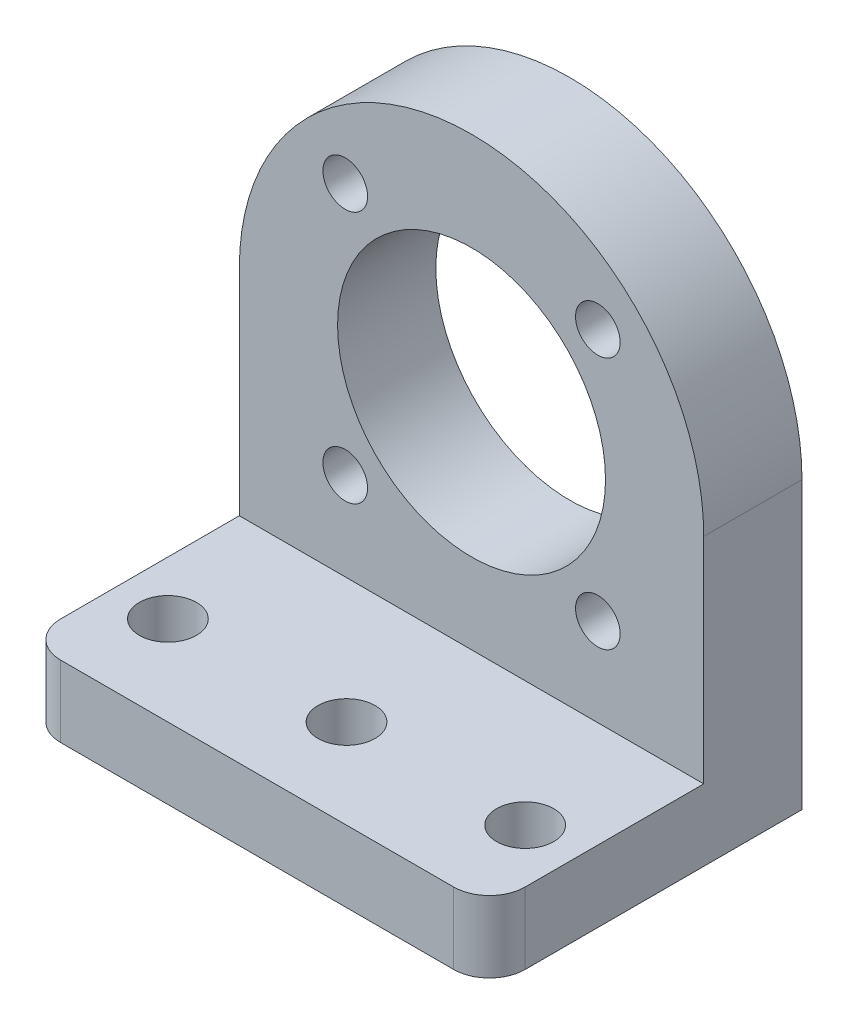
ISO-10303-21;
HEADER;
FILE_DESCRIPTION(('STEP AP214'),'2;1');
FILE_NAME('part.step','',(''),(''),'','','');
FILE_SCHEMA(('AUTOMOTIVE_DESIGN { 1 0 10303 214 1 1 1 1 }'));
ENDSEC;
DATA;
#1=APPLICATION_CONTEXT('core data for automotive mechanical design processes');
#2=APPLICATION_PROTOCOL_DEFINITION('international standard','automotive_design',2000,#1);
#3=PRODUCT_CONTEXT('',#1,'mechanical');
#4=PRODUCT('Part','Part','',(#3));
#5=PRODUCT_RELATED_PRODUCT_CATEGORY('part','',(#4));
#6=PRODUCT_DEFINITION_FORMATION('','',#4);
#7=PRODUCT_DEFINITION_CONTEXT('part definition',#1,'design');
#8=PRODUCT_DEFINITION('design','',#6,#7);
#9=PRODUCT_DEFINITION_SHAPE('','',#8);
#10=(LENGTH_UNIT() NAMED_UNIT(*) SI_UNIT(.MILLI.,.METRE.));
#11=(NAMED_UNIT(*) PLANE_ANGLE_UNIT() SI_UNIT($,.RADIAN.));
#12=(NAMED_UNIT(*) SI_UNIT($,.STERADIAN.) SOLID_ANGLE_UNIT());
#13=UNCERTAINTY_MEASURE_WITH_UNIT(LENGTH_MEASURE(1.E-05),#10,'distance_accuracy_value','');
#14=(GEOMETRIC_REPRESENTATION_CONTEXT(3) GLOBAL_UNCERTAINTY_ASSIGNED_CONTEXT((#13)) GLOBAL_UNIT_ASSIGNED_CONTEXT((#10,
#11,#12)) REPRESENTATION_CONTEXT('',''));
#15=CARTESIAN_POINT('',(0.,0.,0.));
#16=DIRECTION('',(0.,0.,1.));
#17=DIRECTION('',(1.,0.,0.));
#18=AXIS2_PLACEMENT_3D('',#15,#16,#17);
#19=CARTESIAN_POINT('',(0.,0.,5.5));
#20=DIRECTION('',(0.,0.,1.));
#21=DIRECTION('',(1.,0.,0.));
#22=AXIS2_PLACEMENT_3D('',#19,#20,#21);
#23=PLANE('',#22);
#24=DIRECTION('',(-1.,0.,0.));
#25=VECTOR('',#24,1.);
#26=CARTESIAN_POINT('',(-13.,-12.,5.5));
#27=LINE('',#26,#25);
#28=CARTESIAN_POINT('',(13.,-12.,5.5));
#29=VERTEX_POINT('',#28);
#30=CARTESIAN_POINT('',(-13.,-12.,5.5));
#31=VERTEX_POINT('',#30);
#32=EDGE_CURVE('E123',#29,#31,#27,.T.);
#33=ORIENTED_EDGE('',*,*,#32,.F.);
#34=DIRECTION('',(0.,1.,0.));
#35=VECTOR('',#34,1.);
#36=CARTESIAN_POINT('',(13.,-16.,5.5));
#37=LINE('',#36,#35);
#38=CARTESIAN_POINT('',(13.,0.,5.5));
#39=VERTEX_POINT('',#38);
#40=EDGE_CURVE('E129',#29,#39,#37,.T.);
#41=ORIENTED_EDGE('',*,*,#40,.T.);
#42=CARTESIAN_POINT('',(0.,0.,5.5));
#43=DIRECTION('',(0.,0.,1.));
#44=DIRECTION('',(1.,0.,0.));
#45=AXIS2_PLACEMENT_3D('',#42,#43,#44);
#46=CIRCLE('',#45,13.);
#47=CARTESIAN_POINT('',(-13.,0.,5.5));
#48=VERTEX_POINT('',#47);
#49=EDGE_CURVE('E126',#39,#48,#46,.T.);
#50=ORIENTED_EDGE('',*,*,#49,.T.);
#51=DIRECTION('',(0.,-1.,0.));
#52=VECTOR('',#51,1.);
#53=CARTESIAN_POINT('',(-13.,0.,5.5));
#54=LINE('',#53,#52);
#55=EDGE_CURVE('E110',#48,#31,#54,.T.);
#56=ORIENTED_EDGE('',*,*,#55,.T.);
#57=EDGE_LOOP('',(#33,#41,#50,#56));
#58=FACE_BOUND('',#57,.T.);
#59=CARTESIAN_POINT('',(7.07106781186552,-7.07106781186543,5.5));
#60=DIRECTION('',(0.,0.,1.));
#61=DIRECTION('',(1.,0.,0.));
#62=AXIS2_PLACEMENT_3D('',#59,#60,#61);
#63=CIRCLE('',#62,1.25);
#64=CARTESIAN_POINT('',(8.32106781186552,-7.07106781186543,5.5));
#65=VERTEX_POINT('',#64);
#66=EDGE_CURVE('E157',#65,#65,#63,.T.);
#67=ORIENTED_EDGE('',*,*,#66,.F.);
#68=EDGE_LOOP('',(#67));
#69=FACE_BOUND('',#68,.T.);
#70=CARTESIAN_POINT('',(-7.07106781186551,7.07106781186543,5.5));
#71=DIRECTION('',(0.,0.,1.));
#72=DIRECTION('',(1.,0.,0.));
#73=AXIS2_PLACEMENT_3D('',#70,#71,#72);
#74=CIRCLE('',#73,1.25);
#75=CARTESIAN_POINT('',(-5.82106781186551,7.07106781186543,5.5));
#76=VERTEX_POINT('',#75);
#77=EDGE_CURVE('E173',#76,#76,#74,.T.);
#78=ORIENTED_EDGE('',*,*,#77,.F.);
#79=EDGE_LOOP('',(#78));
#80=FACE_BOUND('',#79,.T.);
#81=CARTESIAN_POINT('',(0.,0.,5.5));
#82=DIRECTION('',(0.,0.,1.));
#83=DIRECTION('',(1.,0.,0.));
#84=AXIS2_PLACEMENT_3D('',#81,#82,#83);
#85=CIRCLE('',#84,7.5);
#86=CARTESIAN_POINT('',(7.5,0.,5.5));
#87=VERTEX_POINT('',#86);
#88=EDGE_CURVE('E181',#87,#87,#85,.T.);
#89=ORIENTED_EDGE('',*,*,#88,.F.);
#90=EDGE_LOOP('',(#89));
#91=FACE_BOUND('',#90,.T.);
#92=CARTESIAN_POINT('',(7.07106781186544,7.07106781186551,5.5));
#93=DIRECTION('',(0.,0.,1.));
#94=DIRECTION('',(1.,0.,0.));
#95=AXIS2_PLACEMENT_3D('',#92,#93,#94);
#96=CIRCLE('',#95,1.25);
#97=CARTESIAN_POINT('',(8.32106781186544,7.07106781186551,5.5));
#98=VERTEX_POINT('',#97);
#99=EDGE_CURVE('E165',#98,#98,#96,.T.);
#100=ORIENTED_EDGE('',*,*,#99,.F.);
#101=EDGE_LOOP('',(#100));
#102=FACE_BOUND('',#101,.T.);
#103=CARTESIAN_POINT('',(-7.07106781186543,-7.07106781186552,5.5));
#104=DIRECTION('',(0.,0.,1.));
#105=DIRECTION('',(1.,0.,0.));
#106=AXIS2_PLACEMENT_3D('',#103,#104,#105);
#107=CIRCLE('',#106,1.25);
#108=CARTESIAN_POINT('',(-5.82106781186543,-7.07106781186552,5.5));
#109=VERTEX_POINT('',#108);
#110=EDGE_CURVE('E149',#109,#109,#107,.T.);
#111=ORIENTED_EDGE('',*,*,#110,.F.);
#112=EDGE_LOOP('',(#111));
#113=FACE_BOUND('',#112,.T.);
#114=ADVANCED_FACE('F41',(#58,#69,#80,#91,#102,#113),#23,.T.);
#115=CARTESIAN_POINT('',(0.,0.,0.));
#116=DIRECTION('',(0.,0.,1.));
#117=DIRECTION('',(1.,0.,0.));
#118=AXIS2_PLACEMENT_3D('',#115,#116,#117);
#119=PLANE('',#118);
#120=CARTESIAN_POINT('',(0.,0.,0.));
#121=DIRECTION('',(0.,0.,1.));
#122=DIRECTION('',(1.,0.,0.));
#123=AXIS2_PLACEMENT_3D('',#120,#121,#122);
#124=CIRCLE('',#123,13.);
#125=CARTESIAN_POINT('',(13.,0.,0.));
#126=VERTEX_POINT('',#125);
#127=CARTESIAN_POINT('',(-13.,0.,0.));
#128=VERTEX_POINT('',#127);
#129=EDGE_CURVE('E185',#126,#128,#124,.T.);
#130=ORIENTED_EDGE('',*,*,#129,.F.);
#131=DIRECTION('',(0.,1.,0.));
#132=VECTOR('',#131,1.);
#133=CARTESIAN_POINT('',(13.,-16.,0.));
#134=LINE('',#133,#132);
#135=CARTESIAN_POINT('',(13.,-16.,0.));
#136=VERTEX_POINT('',#135);
#137=EDGE_CURVE('E190',#136,#126,#134,.T.);
#138=ORIENTED_EDGE('',*,*,#137,.F.);
#139=DIRECTION('',(1.,0.,0.));
#140=VECTOR('',#139,1.);
#141=CARTESIAN_POINT('',(-13.,-16.,0.));
#142=LINE('',#141,#140);
#143=CARTESIAN_POINT('',(-13.,-16.,0.));
#144=VERTEX_POINT('',#143);
#145=EDGE_CURVE('E202',#144,#136,#142,.T.);
#146=ORIENTED_EDGE('',*,*,#145,.F.);
#147=DIRECTION('',(0.,-1.,0.));
#148=VECTOR('',#147,1.);
#149=CARTESIAN_POINT('',(-13.,0.,0.));
#150=LINE('',#149,#148);
#151=EDGE_CURVE('E198',#128,#144,#150,.T.);
#152=ORIENTED_EDGE('',*,*,#151,.F.);
#153=EDGE_LOOP('',(#130,#138,#146,#152));
#154=FACE_BOUND('',#153,.T.);
#155=CARTESIAN_POINT('',(0.,0.,0.));
#156=DIRECTION('',(0.,0.,1.));
#157=DIRECTION('',(1.,0.,0.));
#158=AXIS2_PLACEMENT_3D('',#155,#156,#157);
#159=CIRCLE('',#158,7.5);
#160=CARTESIAN_POINT('',(7.5,0.,0.));
#161=VERTEX_POINT('',#160);
#162=EDGE_CURVE('E177',#161,#161,#159,.T.);
#163=ORIENTED_EDGE('',*,*,#162,.T.);
#164=EDGE_LOOP('',(#163));
#165=FACE_BOUND('',#164,.T.);
#166=CARTESIAN_POINT('',(-7.07106781186551,7.07106781186543,0.));
#167=DIRECTION('',(0.,0.,1.));
#168=DIRECTION('',(1.,0.,0.));
#169=AXIS2_PLACEMENT_3D('',#166,#167,#168);
#170=CIRCLE('',#169,1.25);
#171=CARTESIAN_POINT('',(-5.82106781186551,7.07106781186543,0.));
#172=VERTEX_POINT('',#171);
#173=EDGE_CURVE('E169',#172,#172,#170,.T.);
#174=ORIENTED_EDGE('',*,*,#173,.T.);
#175=EDGE_LOOP('',(#174));
#176=FACE_BOUND('',#175,.T.);
#177=CARTESIAN_POINT('',(7.07106781186544,7.07106781186551,0.));
#178=DIRECTION('',(0.,0.,1.));
#179=DIRECTION('',(1.,0.,0.));
#180=AXIS2_PLACEMENT_3D('',#177,#178,#179);
#181=CIRCLE('',#180,1.25);
#182=CARTESIAN_POINT('',(8.32106781186544,7.07106781186551,0.));
#183=VERTEX_POINT('',#182);
#184=EDGE_CURVE('E161',#183,#183,#181,.T.);
#185=ORIENTED_EDGE('',*,*,#184,.T.);
#186=EDGE_LOOP('',(#185));
#187=FACE_BOUND('',#186,.T.);
#188=CARTESIAN_POINT('',(7.07106781186552,-7.07106781186543,0.));
#189=DIRECTION('',(0.,0.,1.));
#190=DIRECTION('',(1.,0.,0.));
#191=AXIS2_PLACEMENT_3D('',#188,#189,#190);
#192=CIRCLE('',#191,1.25);
#193=CARTESIAN_POINT('',(8.32106781186552,-7.07106781186543,0.));
#194=VERTEX_POINT('',#193);
#195=EDGE_CURVE('E153',#194,#194,#192,.T.);
#196=ORIENTED_EDGE('',*,*,#195,.T.);
#197=EDGE_LOOP('',(#196));
#198=FACE_BOUND('',#197,.T.);
#199=CARTESIAN_POINT('',(-7.07106781186543,-7.07106781186552,0.));
#200=DIRECTION('',(0.,0.,1.));
#201=DIRECTION('',(1.,0.,0.));
#202=AXIS2_PLACEMENT_3D('',#199,#200,#201);
#203=CIRCLE('',#202,1.25);
#204=CARTESIAN_POINT('',(-5.82106781186543,-7.07106781186552,0.));
#205=VERTEX_POINT('',#204);
#206=EDGE_CURVE('E148',#205,#205,#203,.T.);
#207=ORIENTED_EDGE('',*,*,#206,.T.);
#208=EDGE_LOOP('',(#207));
#209=FACE_BOUND('',#208,.T.);
#210=ADVANCED_FACE('F255',(#154,#165,#176,#187,#198,#209),#119,.F.);
#211=CARTESIAN_POINT('',(0.,0.,5.5));
#212=DIRECTION('',(0.,0.,-1.));
#213=DIRECTION('',(-1.,0.,0.));
#214=AXIS2_PLACEMENT_3D('',#211,#212,#213);
#215=CYLINDRICAL_SURFACE('',#214,13.);
#216=ORIENTED_EDGE('',*,*,#129,.T.);
#217=DIRECTION('',(0.,0.,-1.));
#218=VECTOR('',#217,1.);
#219=CARTESIAN_POINT('',(-13.,0.,5.5));
#220=LINE('',#219,#218);
#221=EDGE_CURVE('E217',#48,#128,#220,.T.);
#222=ORIENTED_EDGE('',*,*,#221,.F.);
#223=ORIENTED_EDGE('',*,*,#49,.F.);
#224=DIRECTION('',(0.,0.,-1.));
#225=VECTOR('',#224,1.);
#226=CARTESIAN_POINT('',(13.,0.,5.5));
#227=LINE('',#226,#225);
#228=EDGE_CURVE('E194',#39,#126,#227,.T.);
#229=ORIENTED_EDGE('',*,*,#228,.T.);
#230=EDGE_LOOP('',(#216,#222,#223,#229));
#231=FACE_BOUND('',#230,.T.);
#232=ADVANCED_FACE('F252',(#231),#215,.T.);
#233=CARTESIAN_POINT('',(-13.,0.,5.5));
#234=DIRECTION('',(1.,0.,0.));
#235=DIRECTION('',(0.,1.,0.));
#236=AXIS2_PLACEMENT_3D('',#233,#234,#235);
#237=PLANE('',#236);
#238=DIRECTION('',(0.,0.,-1.));
#239=VECTOR('',#238,1.);
#240=CARTESIAN_POINT('',(-13.,-16.,5.5));
#241=LINE('',#240,#239);
#242=CARTESIAN_POINT('',(-13.,-16.,15.5));
#243=VERTEX_POINT('',#242);
#244=EDGE_CURVE('E214',#243,#144,#241,.T.);
#245=ORIENTED_EDGE('',*,*,#244,.F.);
#246=DIRECTION('',(0.,-1.,0.));
#247=VECTOR('',#246,1.);
#248=CARTESIAN_POINT('',(-13.,-12.,15.5));
#249=LINE('',#248,#247);
#250=CARTESIAN_POINT('',(-13.,-12.,15.5));
#251=VERTEX_POINT('',#250);
#252=EDGE_CURVE('E11',#243,#251,#249,.F.);
#253=ORIENTED_EDGE('',*,*,#252,.T.);
#254=DIRECTION('',(0.,0.,-1.));
#255=VECTOR('',#254,1.);
#256=CARTESIAN_POINT('',(-13.,-12.,17.5));
#257=LINE('',#256,#255);
#258=EDGE_CURVE('E106',#251,#31,#257,.T.);
#259=ORIENTED_EDGE('',*,*,#258,.T.);
#260=ORIENTED_EDGE('',*,*,#55,.F.);
#261=ORIENTED_EDGE('',*,*,#221,.T.);
#262=ORIENTED_EDGE('',*,*,#151,.T.);
#263=EDGE_LOOP('',(#245,#253,#259,#260,#261,#262));
#264=FACE_BOUND('',#263,.T.);
#265=ADVANCED_FACE('F108',(#264),#237,.F.);
#266=CARTESIAN_POINT('',(-13.,-16.,5.5));
#267=DIRECTION('',(0.,1.,0.));
#268=DIRECTION('',(0.,0.,1.));
#269=AXIS2_PLACEMENT_3D('',#266,#267,#268);
#270=PLANE('',#269);
#271=CARTESIAN_POINT('',(-10.,-16.,12.5));
#272=DIRECTION('',(0.,1.,0.));
#273=DIRECTION('',(0.,0.,1.));
#274=AXIS2_PLACEMENT_3D('',#271,#272,#273);
#275=CIRCLE('',#274,1.6);
#276=CARTESIAN_POINT('',(-10.,-16.,14.1));
#277=VERTEX_POINT('',#276);
#278=EDGE_CURVE('E135',#277,#277,#275,.T.);
#279=ORIENTED_EDGE('',*,*,#278,.T.);
#280=EDGE_LOOP('',(#279));
#281=FACE_BOUND('',#280,.T.);
#282=CARTESIAN_POINT('',(0.,-16.,12.5));
#283=DIRECTION('',(0.,1.,0.));
#284=DIRECTION('',(0.,0.,1.));
#285=AXIS2_PLACEMENT_3D('',#282,#283,#284);
#286=CIRCLE('',#285,1.6);
#287=CARTESIAN_POINT('',(0.,-16.,14.1));
#288=VERTEX_POINT('',#287);
#289=EDGE_CURVE('E142',#288,#288,#286,.T.);
#290=ORIENTED_EDGE('',*,*,#289,.T.);
#291=EDGE_LOOP('',(#290));
#292=FACE_BOUND('',#291,.T.);
#293=CARTESIAN_POINT('',(10.,-16.,12.5));
#294=DIRECTION('',(0.,1.,0.));
#295=DIRECTION('',(0.,0.,1.));
#296=AXIS2_PLACEMENT_3D('',#293,#294,#295);
#297=CIRCLE('',#296,1.6);
#298=CARTESIAN_POINT('',(10.,-16.,14.1));
#299=VERTEX_POINT('',#298);
#300=EDGE_CURVE('E464',#299,#299,#297,.T.);
#301=ORIENTED_EDGE('',*,*,#300,.T.);
#302=EDGE_LOOP('',(#301));
#303=FACE_BOUND('',#302,.T.);
#304=DIRECTION('',(0.,0.,-1.));
#305=VECTOR('',#304,1.);
#306=CARTESIAN_POINT('',(13.,-16.,5.5));
#307=LINE('',#306,#305);
#308=CARTESIAN_POINT('',(13.,-16.,15.5));
#309=VERTEX_POINT('',#308);
#310=EDGE_CURVE('E211',#309,#136,#307,.T.);
#311=ORIENTED_EDGE('',*,*,#310,.F.);
#312=CARTESIAN_POINT('',(11.,-16.,15.5));
#313=DIRECTION('',(0.,1.,0.));
#314=DIRECTION('',(0.,0.,1.));
#315=AXIS2_PLACEMENT_3D('',#312,#313,#314);
#316=CIRCLE('',#315,2.);
#317=CARTESIAN_POINT('',(11.,-16.,17.5));
#318=VERTEX_POINT('',#317);
#319=EDGE_CURVE('E50',#309,#318,#316,.F.);
#320=ORIENTED_EDGE('',*,*,#319,.T.);
#321=DIRECTION('',(1.,0.,0.));
#322=VECTOR('',#321,1.);
#323=CARTESIAN_POINT('',(-13.,-16.,17.5));
#324=LINE('',#323,#322);
#325=CARTESIAN_POINT('',(-11.,-16.,17.5));
#326=VERTEX_POINT('',#325);
#327=EDGE_CURVE('E134',#326,#318,#324,.T.);
#328=ORIENTED_EDGE('',*,*,#327,.F.);
#329=CARTESIAN_POINT('',(-11.,-16.,15.5));
#330=DIRECTION('',(0.,1.,0.));
#331=DIRECTION('',(0.,0.,1.));
#332=AXIS2_PLACEMENT_3D('',#329,#330,#331);
#333=CIRCLE('',#332,2.);
#334=EDGE_CURVE('E57',#326,#243,#333,.F.);
#335=ORIENTED_EDGE('',*,*,#334,.T.);
#336=ORIENTED_EDGE('',*,*,#244,.T.);
#337=ORIENTED_EDGE('',*,*,#145,.T.);
#338=EDGE_LOOP('',(#311,#320,#328,#335,#336,#337));
#339=FACE_BOUND('',#338,.T.);
#340=ADVANCED_FACE('F239',(#281,#292,#303,#339),#270,.F.);
#341=CARTESIAN_POINT('',(13.,-16.,5.5));
#342=DIRECTION('',(-1.,0.,0.));
#343=DIRECTION('',(0.,-1.,0.));
#344=AXIS2_PLACEMENT_3D('',#341,#342,#343);
#345=PLANE('',#344);
#346=DIRECTION('',(0.,0.,-1.));
#347=VECTOR('',#346,1.);
#348=CARTESIAN_POINT('',(13.,-12.,17.5));
#349=LINE('',#348,#347);
#350=CARTESIAN_POINT('',(13.,-12.,15.5));
#351=VERTEX_POINT('',#350);
#352=EDGE_CURVE('E117',#351,#29,#349,.T.);
#353=ORIENTED_EDGE('',*,*,#352,.F.);
#354=DIRECTION('',(0.,1.,0.));
#355=VECTOR('',#354,1.);
#356=CARTESIAN_POINT('',(13.,-16.,15.5));
#357=LINE('',#356,#355);
#358=EDGE_CURVE('E65',#351,#309,#357,.F.);
#359=ORIENTED_EDGE('',*,*,#358,.T.);
#360=ORIENTED_EDGE('',*,*,#310,.T.);
#361=ORIENTED_EDGE('',*,*,#137,.T.);
#362=ORIENTED_EDGE('',*,*,#228,.F.);
#363=ORIENTED_EDGE('',*,*,#40,.F.);
#364=EDGE_LOOP('',(#353,#359,#360,#361,#362,#363));
#365=FACE_BOUND('',#364,.T.);
#366=ADVANCED_FACE('F247',(#365),#345,.F.);
#367=CARTESIAN_POINT('',(0.,0.,5.5));
#368=DIRECTION('',(0.,0.,-1.));
#369=DIRECTION('',(-1.,0.,0.));
#370=AXIS2_PLACEMENT_3D('',#367,#368,#369);
#371=CYLINDRICAL_SURFACE('',#370,7.5);
#372=ORIENTED_EDGE('',*,*,#88,.T.);
#373=EDGE_LOOP('',(#372));
#374=FACE_BOUND('',#373,.T.);
#375=ORIENTED_EDGE('',*,*,#162,.F.);
#376=EDGE_LOOP('',(#375));
#377=FACE_BOUND('',#376,.T.);
#378=ADVANCED_FACE('F288',(#374,#377),#371,.F.);
#379=CARTESIAN_POINT('',(-7.07106781186551,7.07106781186543,5.5));
#380=DIRECTION('',(0.,0.,-1.));
#381=DIRECTION('',(-1.,0.,0.));
#382=AXIS2_PLACEMENT_3D('',#379,#380,#381);
#383=CYLINDRICAL_SURFACE('',#382,1.25);
#384=ORIENTED_EDGE('',*,*,#77,.T.);
#385=EDGE_LOOP('',(#384));
#386=FACE_BOUND('',#385,.T.);
#387=ORIENTED_EDGE('',*,*,#173,.F.);
#388=EDGE_LOOP('',(#387));
#389=FACE_BOUND('',#388,.T.);
#390=ADVANCED_FACE('F377',(#386,#389),#383,.F.);
#391=CARTESIAN_POINT('',(7.07106781186544,7.07106781186551,5.5));
#392=DIRECTION('',(0.,0.,-1.));
#393=DIRECTION('',(-1.,0.,0.));
#394=AXIS2_PLACEMENT_3D('',#391,#392,#393);
#395=CYLINDRICAL_SURFACE('',#394,1.25);
#396=ORIENTED_EDGE('',*,*,#99,.T.);
#397=EDGE_LOOP('',(#396));
#398=FACE_BOUND('',#397,.T.);
#399=ORIENTED_EDGE('',*,*,#184,.F.);
#400=EDGE_LOOP('',(#399));
#401=FACE_BOUND('',#400,.T.);
#402=ADVANCED_FACE('F280',(#398,#401),#395,.F.);
#403=CARTESIAN_POINT('',(7.07106781186552,-7.07106781186543,5.5));
#404=DIRECTION('',(0.,0.,-1.));
#405=DIRECTION('',(-1.,0.,0.));
#406=AXIS2_PLACEMENT_3D('',#403,#404,#405);
#407=CYLINDRICAL_SURFACE('',#406,1.25);
#408=ORIENTED_EDGE('',*,*,#66,.T.);
#409=EDGE_LOOP('',(#408));
#410=FACE_BOUND('',#409,.T.);
#411=ORIENTED_EDGE('',*,*,#195,.F.);
#412=EDGE_LOOP('',(#411));
#413=FACE_BOUND('',#412,.T.);
#414=ADVANCED_FACE('F271',(#410,#413),#407,.F.);
#415=CARTESIAN_POINT('',(-7.07106781186543,-7.07106781186552,5.5));
#416=DIRECTION('',(0.,0.,-1.));
#417=DIRECTION('',(-1.,0.,0.));
#418=AXIS2_PLACEMENT_3D('',#415,#416,#417);
#419=CYLINDRICAL_SURFACE('',#418,1.25);
#420=ORIENTED_EDGE('',*,*,#110,.T.);
#421=EDGE_LOOP('',(#420));
#422=FACE_BOUND('',#421,.T.);
#423=ORIENTED_EDGE('',*,*,#206,.F.);
#424=EDGE_LOOP('',(#423));
#425=FACE_BOUND('',#424,.T.);
#426=ADVANCED_FACE('F269',(#422,#425),#419,.F.);
#427=CARTESIAN_POINT('',(-13.,-12.,17.5));
#428=DIRECTION('',(0.,-1.,0.));
#429=DIRECTION('',(0.,0.,-1.));
#430=AXIS2_PLACEMENT_3D('',#427,#428,#429);
#431=PLANE('',#430);
#432=CARTESIAN_POINT('',(-10.,-12.,12.5));
#433=DIRECTION('',(0.,1.,0.));
#434=DIRECTION('',(0.,0.,1.));
#435=AXIS2_PLACEMENT_3D('',#432,#433,#434);
#436=CIRCLE('',#435,1.6);
#437=CARTESIAN_POINT('',(-10.,-12.,14.1));
#438=VERTEX_POINT('',#437);
#439=EDGE_CURVE('E467',#438,#438,#436,.T.);
#440=ORIENTED_EDGE('',*,*,#439,.F.);
#441=EDGE_LOOP('',(#440));
#442=FACE_BOUND('',#441,.T.);
#443=CARTESIAN_POINT('',(0.,-12.,12.5));
#444=DIRECTION('',(0.,1.,0.));
#445=DIRECTION('',(0.,0.,1.));
#446=AXIS2_PLACEMENT_3D('',#443,#444,#445);
#447=CIRCLE('',#446,1.6);
#448=CARTESIAN_POINT('',(0.,-12.,14.1));
#449=VERTEX_POINT('',#448);
#450=EDGE_CURVE('E473',#449,#449,#447,.T.);
#451=ORIENTED_EDGE('',*,*,#450,.F.);
#452=EDGE_LOOP('',(#451));
#453=FACE_BOUND('',#452,.T.);
#454=CARTESIAN_POINT('',(10.,-12.,12.5));
#455=DIRECTION('',(0.,1.,0.));
#456=DIRECTION('',(0.,0.,1.));
#457=AXIS2_PLACEMENT_3D('',#454,#455,#456);
#458=CIRCLE('',#457,1.6);
#459=CARTESIAN_POINT('',(10.,-12.,14.1));
#460=VERTEX_POINT('',#459);
#461=EDGE_CURVE('E461',#460,#460,#458,.T.);
#462=ORIENTED_EDGE('',*,*,#461,.F.);
#463=EDGE_LOOP('',(#462));
#464=FACE_BOUND('',#463,.T.);
#465=DIRECTION('',(-1.,0.,0.));
#466=VECTOR('',#465,1.);
#467=CARTESIAN_POINT('',(-13.,-12.,17.5));
#468=LINE('',#467,#466);
#469=CARTESIAN_POINT('',(11.,-12.,17.5));
#470=VERTEX_POINT('',#469);
#471=CARTESIAN_POINT('',(-11.,-12.,17.5));
#472=VERTEX_POINT('',#471);
#473=EDGE_CURVE('E118',#470,#472,#468,.T.);
#474=ORIENTED_EDGE('',*,*,#473,.F.);
#475=CARTESIAN_POINT('',(11.,-12.,15.5));
#476=DIRECTION('',(0.,-1.,0.));
#477=DIRECTION('',(0.,0.,-1.));
#478=AXIS2_PLACEMENT_3D('',#475,#476,#477);
#479=CIRCLE('',#478,2.);
#480=EDGE_CURVE('E231',#470,#351,#479,.F.);
#481=ORIENTED_EDGE('',*,*,#480,.T.);
#482=ORIENTED_EDGE('',*,*,#352,.T.);
#483=ORIENTED_EDGE('',*,*,#32,.T.);
#484=ORIENTED_EDGE('',*,*,#258,.F.);
#485=CARTESIAN_POINT('',(-11.,-12.,15.5));
#486=DIRECTION('',(0.,-1.,0.));
#487=DIRECTION('',(0.,0.,-1.));
#488=AXIS2_PLACEMENT_3D('',#485,#486,#487);
#489=CIRCLE('',#488,2.);
#490=EDGE_CURVE('E228',#251,#472,#489,.F.);
#491=ORIENTED_EDGE('',*,*,#490,.T.);
#492=EDGE_LOOP('',(#474,#481,#482,#483,#484,#491));
#493=FACE_BOUND('',#492,.T.);
#494=ADVANCED_FACE('F132',(#442,#453,#464,#493),#431,.F.);
#495=CARTESIAN_POINT('',(0.,0.,17.5));
#496=DIRECTION('',(0.,0.,1.));
#497=DIRECTION('',(1.,0.,0.));
#498=AXIS2_PLACEMENT_3D('',#495,#496,#497);
#499=PLANE('',#498);
#500=ORIENTED_EDGE('',*,*,#327,.T.);
#501=DIRECTION('',(0.,1.,0.));
#502=VECTOR('',#501,1.);
#503=CARTESIAN_POINT('',(11.,-12.,17.5));
#504=LINE('',#503,#502);
#505=EDGE_CURVE('E224',#318,#470,#504,.T.);
#506=ORIENTED_EDGE('',*,*,#505,.T.);
#507=ORIENTED_EDGE('',*,*,#473,.T.);
#508=DIRECTION('',(0.,-1.,0.));
#509=VECTOR('',#508,1.);
#510=CARTESIAN_POINT('',(-11.,-16.,17.5));
#511=LINE('',#510,#509);
#512=EDGE_CURVE('E220',#472,#326,#511,.T.);
#513=ORIENTED_EDGE('',*,*,#512,.T.);
#514=EDGE_LOOP('',(#500,#506,#507,#513));
#515=FACE_BOUND('',#514,.T.);
#516=ADVANCED_FACE('F243',(#515),#499,.T.);
#517=CARTESIAN_POINT('',(10.,-24.,12.5));
#518=DIRECTION('',(0.,1.,0.));
#519=DIRECTION('',(0.,0.,1.));
#520=AXIS2_PLACEMENT_3D('',#517,#518,#519);
#521=CYLINDRICAL_SURFACE('',#520,1.6);
#522=ORIENTED_EDGE('',*,*,#461,.T.);
#523=EDGE_LOOP('',(#522));
#524=FACE_BOUND('',#523,.T.);
#525=ORIENTED_EDGE('',*,*,#300,.F.);
#526=EDGE_LOOP('',(#525));
#527=FACE_BOUND('',#526,.T.);
#528=ADVANCED_FACE('F312',(#524,#527),#521,.F.);
#529=CARTESIAN_POINT('',(0.,-24.,12.5));
#530=DIRECTION('',(0.,1.,0.));
#531=DIRECTION('',(0.,0.,1.));
#532=AXIS2_PLACEMENT_3D('',#529,#530,#531);
#533=CYLINDRICAL_SURFACE('',#532,1.6);
#534=ORIENTED_EDGE('',*,*,#450,.T.);
#535=EDGE_LOOP('',(#534));
#536=FACE_BOUND('',#535,.T.);
#537=ORIENTED_EDGE('',*,*,#289,.F.);
#538=EDGE_LOOP('',(#537));
#539=FACE_BOUND('',#538,.T.);
#540=ADVANCED_FACE('F306',(#536,#539),#533,.F.);
#541=CARTESIAN_POINT('',(-10.,-24.,12.5));
#542=DIRECTION('',(0.,1.,0.));
#543=DIRECTION('',(0.,0.,1.));
#544=AXIS2_PLACEMENT_3D('',#541,#542,#543);
#545=CYLINDRICAL_SURFACE('',#544,1.6);
#546=ORIENTED_EDGE('',*,*,#439,.T.);
#547=EDGE_LOOP('',(#546));
#548=FACE_BOUND('',#547,.T.);
#549=ORIENTED_EDGE('',*,*,#278,.F.);
#550=EDGE_LOOP('',(#549));
#551=FACE_BOUND('',#550,.T.);
#552=ADVANCED_FACE('F300',(#548,#551),#545,.F.);
#553=CARTESIAN_POINT('',(11.,0.,15.5));
#554=DIRECTION('',(0.,-1.,0.));
#555=DIRECTION('',(1.,0.,0.));
#556=AXIS2_PLACEMENT_3D('',#553,#554,#555);
#557=CYLINDRICAL_SURFACE('',#556,2.);
#558=ORIENTED_EDGE('',*,*,#319,.F.);
#559=ORIENTED_EDGE('',*,*,#358,.F.);
#560=ORIENTED_EDGE('',*,*,#480,.F.);
#561=ORIENTED_EDGE('',*,*,#505,.F.);
#562=EDGE_LOOP('',(#558,#559,#560,#561));
#563=FACE_BOUND('',#562,.T.);
#564=ADVANCED_FACE('F246',(#563),#557,.T.);
#565=CARTESIAN_POINT('',(-11.,0.,15.5));
#566=DIRECTION('',(0.,1.,0.));
#567=DIRECTION('',(-1.,0.,0.));
#568=AXIS2_PLACEMENT_3D('',#565,#566,#567);
#569=CYLINDRICAL_SURFACE('',#568,2.);
#570=ORIENTED_EDGE('',*,*,#490,.F.);
#571=ORIENTED_EDGE('',*,*,#252,.F.);
#572=ORIENTED_EDGE('',*,*,#334,.F.);
#573=ORIENTED_EDGE('',*,*,#512,.F.);
#574=EDGE_LOOP('',(#570,#571,#572,#573));
#575=FACE_BOUND('',#574,.T.);
#576=ADVANCED_FACE('F43',(#575),#569,.T.);
#577=CLOSED_SHELL('',(#114,#210,#232,#265,#340,#366,#378,#390,#402,#414,#426,#494,#516,#528,
#540,#552,#564,#576));
#578=MANIFOLD_SOLID_BREP('B2',#577);
#579=ADVANCED_BREP_SHAPE_REPRESENTATION('',(#18,#578),#14);
#580=SHAPE_DEFINITION_REPRESENTATION(#9,#579);
ENDSEC;
END-ISO-10303-21;
